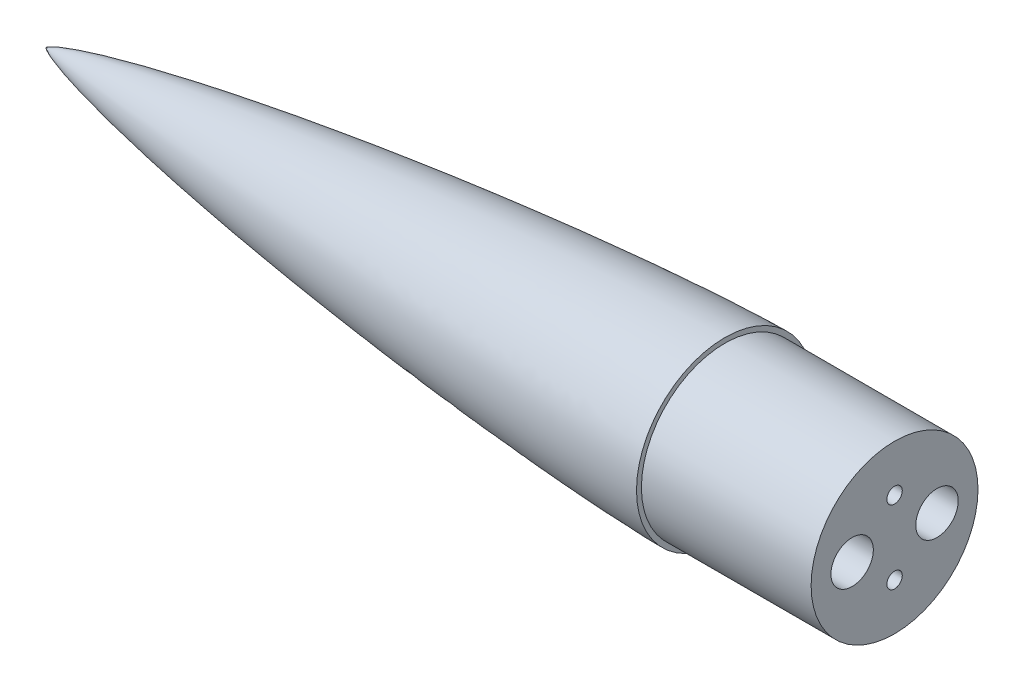
ISO-10303-21;
HEADER;
FILE_DESCRIPTION(('STEP AP214'),'2;1');
FILE_NAME('part.step','',(''),(''),'','','');
FILE_SCHEMA(('AUTOMOTIVE_DESIGN { 1 0 10303 214 1 1 1 1 }'));
ENDSEC;
DATA;
#1=APPLICATION_CONTEXT('core data for automotive mechanical design processes');
#2=APPLICATION_PROTOCOL_DEFINITION('international standard','automotive_design',2000,#1);
#3=PRODUCT_CONTEXT('',#1,'mechanical');
#4=PRODUCT('Part','Part','',(#3));
#5=PRODUCT_RELATED_PRODUCT_CATEGORY('part','',(#4));
#6=PRODUCT_DEFINITION_FORMATION('','',#4);
#7=PRODUCT_DEFINITION_CONTEXT('part definition',#1,'design');
#8=PRODUCT_DEFINITION('design','',#6,#7);
#9=PRODUCT_DEFINITION_SHAPE('','',#8);
#10=(LENGTH_UNIT() NAMED_UNIT(*) SI_UNIT(.MILLI.,.METRE.));
#11=(NAMED_UNIT(*) PLANE_ANGLE_UNIT() SI_UNIT($,.RADIAN.));
#12=(NAMED_UNIT(*) SI_UNIT($,.STERADIAN.) SOLID_ANGLE_UNIT());
#13=UNCERTAINTY_MEASURE_WITH_UNIT(LENGTH_MEASURE(1.E-05),#10,'distance_accuracy_value','');
#14=(GEOMETRIC_REPRESENTATION_CONTEXT(3) GLOBAL_UNCERTAINTY_ASSIGNED_CONTEXT((#13)) GLOBAL_UNIT_ASSIGNED_CONTEXT((#10,
#11,#12)) REPRESENTATION_CONTEXT('',''));
#15=CARTESIAN_POINT('',(0.,0.,0.));
#16=DIRECTION('',(0.,0.,1.));
#17=DIRECTION('',(1.,0.,0.));
#18=AXIS2_PLACEMENT_3D('',#15,#16,#17);
#19=CARTESIAN_POINT('',(304.8,39.6748,0.));
#20=CARTESIAN_POINT('',(303.872082373973,39.671991976614,0.));
#21=CARTESIAN_POINT('',(302.016351639773,39.6495279999501,0.));
#22=CARTESIAN_POINT('',(298.305297440179,39.5803641603281,0.));
#23=CARTESIAN_POINT('',(289.805240869329,39.3397638003717,0.));
#24=CARTESIAN_POINT('',(277.4482923978,38.8292806671547,0.));
#25=CARTESIAN_POINT('',(261.241034268989,37.946600904853,0.));
#26=CARTESIAN_POINT('',(242.117188184233,36.6609808305585,0.));
#27=CARTESIAN_POINT('',(223.0084239732,35.1693661901991,0.));
#28=CARTESIAN_POINT('',(203.91514310052,33.4914676621827,0.));
#29=CARTESIAN_POINT('',(184.838106863507,31.638406978994,0.));
#30=CARTESIAN_POINT('',(165.778389570867,29.61481333413,0.));
#31=CARTESIAN_POINT('',(146.737633519414,27.4201336829005,0.));
#32=CARTESIAN_POINT('',(127.717963156555,25.0491135623444,0.));
#33=CARTESIAN_POINT('',(108.72270084017,22.4899976431651,0.));
#34=CARTESIAN_POINT('',(89.7562015035542,19.7244788911179,0.));
#35=CARTESIAN_POINT('',(70.8260307270531,16.72025635435,0.));
#36=CARTESIAN_POINT('',(51.9432438425553,13.4279106434573,0.));
#37=CARTESIAN_POINT('',(35.4348928714502,10.1995812292026,0.));
#38=CARTESIAN_POINT('',(22.086176793402,7.22996087670975,0.));
#39=CARTESIAN_POINT('',(12.6051442460218,4.76514298141007,0.));
#40=CARTESIAN_POINT('',(7.33062072263953,3.18453892450289,0.));
#41=CARTESIAN_POINT('',(4.16331169730398,2.08513387501985,0.));
#42=CARTESIAN_POINT('',(2.42150746169733,1.38792199920585,0.));
#43=CARTESIAN_POINT('',(1.45854263335302,0.948387219531718,0.));
#44=CARTESIAN_POINT('',(0.906754262882924,0.663154837131609,0.));
#45=CARTESIAN_POINT('',(0.581878865349174,0.475164864660977,0.));
#46=CARTESIAN_POINT('',(0.388654902415941,0.350880874644519,0.));
#47=CARTESIAN_POINT('',(0.261246618164474,0.260372290270949,0.));
#48=CARTESIAN_POINT('',(0.168386027419517,0.187594695998197,0.));
#49=CARTESIAN_POINT('',(0.104001435047584,0.131550788230049,0.));
#50=CARTESIAN_POINT('',(0.0549775205160579,0.082482136166313,0.));
#51=CARTESIAN_POINT('',(0.0214451202254663,0.041133144768579,0.));
#52=CARTESIAN_POINT('',(0.00701970951419905,0.0186474513729437,0.));
#53=CARTESIAN_POINT('',(0.00199001597706555,0.00638034282283625,0.));
#54=CARTESIAN_POINT('',(0.,0.,0.));
#55=B_SPLINE_CURVE_WITH_KNOTS('',4,(#19,#20,#21,#22,#23,#24,#25,#26,#27,#28,#29,#30,#31,#32,#33,
#34,#35,#36,#37,#38,#39,#40,#41,#42,#43,#44,#45,#46,#47,#48,#49,#50,#51,#52,#53,#54),
.UNSPECIFIED.,.F.,.F.,(5,1,1,1,1,1,1,1,1,1,1,1,1,1,1,1,1,1,1,1,1,1,1,1,1,1,1,1,1,1,1,1,5),(0.,
0.0120407224304167,0.0240814448608334,0.0481628897216668,0.110339603302425,0.172516315880672,
0.234693028557676,0.296869741619763,0.35904645437603,0.421223166627213,0.483399880722471,
0.545576592716714,0.607753304395923,0.669930016432356,0.732106728284708,0.794283440311138,
0.85646015608543,0.918636853254426,0.950360387088669,0.971698723752524,0.983552076312659,
0.990067750985845,0.993851378605739,0.996035286875387,0.997282787614793,0.998124662362034,
0.998720392553439,0.999015250050672,0.999310107547904,0.999655053773952,0.999827526886976,
0.999913763443488,1.),.UNSPECIFIED.);
#56=CARTESIAN_POINT('',(0.,0.,0.));
#57=DIRECTION('',(-1.,0.,0.));
#58=AXIS1_PLACEMENT('',#56,#57);
#59=SURFACE_OF_REVOLUTION('',#55,#58);
#60=CARTESIAN_POINT('',(0.,0.,0.));
#61=VERTEX_POINT('',#60);
#62=VERTEX_LOOP('',#61);
#63=FACE_BOUND('',#62,.T.);
#64=CARTESIAN_POINT('',(304.8,0.,0.));
#65=DIRECTION('',(-1.,0.,0.));
#66=DIRECTION('',(0.,0.,1.));
#67=AXIS2_PLACEMENT_3D('',#64,#65,#66);
#68=CIRCLE('',#67,39.6748);
#69=CARTESIAN_POINT('',(304.8,0.,39.6748));
#70=VERTEX_POINT('',#69);
#71=EDGE_CURVE('E51',#70,#70,#68,.T.);
#72=ORIENTED_EDGE('',*,*,#71,.T.);
#73=EDGE_LOOP('',(#72));
#74=FACE_BOUND('',#73,.T.);
#75=ADVANCED_FACE('F43',(#63,#74),#59,.T.);
#76=CARTESIAN_POINT('',(304.8,0.,0.));
#77=DIRECTION('',(-1.,0.,0.));
#78=DIRECTION('',(0.,0.,1.));
#79=AXIS2_PLACEMENT_3D('',#76,#77,#78);
#80=PLANE('',#79);
#81=CARTESIAN_POINT('',(304.8,0.,0.));
#82=DIRECTION('',(-1.,0.,0.));
#83=DIRECTION('',(0.,0.,1.));
#84=AXIS2_PLACEMENT_3D('',#81,#82,#83);
#85=CIRCLE('',#84,37.465);
#86=CARTESIAN_POINT('',(304.8,0.,37.465));
#87=VERTEX_POINT('',#86);
#88=EDGE_CURVE('E11',#87,#87,#85,.F.);
#89=ORIENTED_EDGE('',*,*,#88,.F.);
#90=EDGE_LOOP('',(#89));
#91=FACE_BOUND('',#90,.T.);
#92=ORIENTED_EDGE('',*,*,#71,.F.);
#93=EDGE_LOOP('',(#92));
#94=FACE_BOUND('',#93,.T.);
#95=ADVANCED_FACE('F56',(#91,#94),#80,.F.);
#96=CARTESIAN_POINT('',(355.6,0.,0.));
#97=DIRECTION('',(-1.,0.,0.));
#98=DIRECTION('',(0.,0.,1.));
#99=AXIS2_PLACEMENT_3D('',#96,#97,#98);
#100=CYLINDRICAL_SURFACE('',#99,37.465);
#101=ORIENTED_EDGE('',*,*,#88,.T.);
#102=EDGE_LOOP('',(#101));
#103=FACE_BOUND('',#102,.T.);
#104=CARTESIAN_POINT('',(381.,0.,0.));
#105=DIRECTION('',(1.,0.,0.));
#106=DIRECTION('',(0.,0.,-1.));
#107=AXIS2_PLACEMENT_3D('',#104,#105,#106);
#108=CIRCLE('',#107,37.465);
#109=CARTESIAN_POINT('',(381.,0.,-37.465));
#110=VERTEX_POINT('',#109);
#111=EDGE_CURVE('E76',#110,#110,#108,.T.);
#112=ORIENTED_EDGE('',*,*,#111,.F.);
#113=EDGE_LOOP('',(#112));
#114=FACE_BOUND('',#113,.T.);
#115=ADVANCED_FACE('F118',(#103,#114),#100,.T.);
#116=CARTESIAN_POINT('',(381.,0.,0.));
#117=DIRECTION('',(1.,0.,0.));
#118=DIRECTION('',(0.,0.,-1.));
#119=AXIS2_PLACEMENT_3D('',#116,#117,#118);
#120=PLANE('',#119);
#121=CARTESIAN_POINT('',(381.,16.51,0.));
#122=DIRECTION('',(1.,0.,0.));
#123=DIRECTION('',(0.,0.,-1.));
#124=AXIS2_PLACEMENT_3D('',#121,#122,#123);
#125=CIRCLE('',#124,3.4671);
#126=CARTESIAN_POINT('',(381.,16.51,-3.4671));
#127=VERTEX_POINT('',#126);
#128=EDGE_CURVE('E97',#127,#127,#125,.T.);
#129=ORIENTED_EDGE('',*,*,#128,.F.);
#130=EDGE_LOOP('',(#129));
#131=FACE_BOUND('',#130,.T.);
#132=CARTESIAN_POINT('',(381.,-16.51,0.));
#133=DIRECTION('',(1.,0.,0.));
#134=DIRECTION('',(0.,0.,-1.));
#135=AXIS2_PLACEMENT_3D('',#132,#133,#134);
#136=CIRCLE('',#135,3.4671);
#137=CARTESIAN_POINT('',(381.,-16.51,-3.4671));
#138=VERTEX_POINT('',#137);
#139=EDGE_CURVE('E93',#138,#138,#136,.T.);
#140=ORIENTED_EDGE('',*,*,#139,.F.);
#141=EDGE_LOOP('',(#140));
#142=FACE_BOUND('',#141,.T.);
#143=CARTESIAN_POINT('',(381.,0.,19.05));
#144=DIRECTION('',(1.,0.,0.));
#145=DIRECTION('',(0.,0.,-1.));
#146=AXIS2_PLACEMENT_3D('',#143,#144,#145);
#147=CIRCLE('',#146,9.525);
#148=CARTESIAN_POINT('',(381.,0.,9.525));
#149=VERTEX_POINT('',#148);
#150=EDGE_CURVE('E80',#149,#149,#147,.T.);
#151=ORIENTED_EDGE('',*,*,#150,.F.);
#152=EDGE_LOOP('',(#151));
#153=FACE_BOUND('',#152,.T.);
#154=ORIENTED_EDGE('',*,*,#111,.T.);
#155=EDGE_LOOP('',(#154));
#156=FACE_BOUND('',#155,.T.);
#157=CARTESIAN_POINT('',(381.,0.,-19.05));
#158=DIRECTION('',(1.,0.,0.));
#159=DIRECTION('',(0.,0.,-1.));
#160=AXIS2_PLACEMENT_3D('',#157,#158,#159);
#161=CIRCLE('',#160,9.525);
#162=CARTESIAN_POINT('',(381.,0.,-28.575));
#163=VERTEX_POINT('',#162);
#164=EDGE_CURVE('E84',#163,#163,#161,.T.);
#165=ORIENTED_EDGE('',*,*,#164,.F.);
#166=EDGE_LOOP('',(#165));
#167=FACE_BOUND('',#166,.T.);
#168=ADVANCED_FACE('F114',(#131,#142,#153,#156,#167),#120,.T.);
#169=CARTESIAN_POINT('',(381.,0.,19.05));
#170=DIRECTION('',(-1.,0.,0.));
#171=DIRECTION('',(0.,0.,1.));
#172=AXIS2_PLACEMENT_3D('',#169,#170,#171);
#173=CYLINDRICAL_SURFACE('',#172,9.525);
#174=ORIENTED_EDGE('',*,*,#150,.T.);
#175=EDGE_LOOP('',(#174));
#176=FACE_BOUND('',#175,.T.);
#177=CARTESIAN_POINT('',(355.6,0.,19.05));
#178=DIRECTION('',(1.,0.,0.));
#179=DIRECTION('',(0.,0.,-1.));
#180=AXIS2_PLACEMENT_3D('',#177,#178,#179);
#181=CIRCLE('',#180,9.525);
#182=CARTESIAN_POINT('',(355.6,0.,28.575));
#183=VERTEX_POINT('',#182);
#184=EDGE_CURVE('E64',#183,#183,#181,.T.);
#185=ORIENTED_EDGE('',*,*,#184,.F.);
#186=EDGE_LOOP('',(#185));
#187=FACE_BOUND('',#186,.T.);
#188=ADVANCED_FACE('F117',(#176,#187),#173,.F.);
#189=CARTESIAN_POINT('',(381.,0.,-19.05));
#190=DIRECTION('',(-1.,0.,0.));
#191=DIRECTION('',(0.,0.,1.));
#192=AXIS2_PLACEMENT_3D('',#189,#190,#191);
#193=CYLINDRICAL_SURFACE('',#192,9.525);
#194=ORIENTED_EDGE('',*,*,#164,.T.);
#195=EDGE_LOOP('',(#194));
#196=FACE_BOUND('',#195,.T.);
#197=CARTESIAN_POINT('',(355.6,0.,-19.05));
#198=DIRECTION('',(-1.,0.,0.));
#199=DIRECTION('',(0.,0.,1.));
#200=AXIS2_PLACEMENT_3D('',#197,#198,#199);
#201=CIRCLE('',#200,9.525);
#202=CARTESIAN_POINT('',(355.6,0.,-28.575));
#203=VERTEX_POINT('',#202);
#204=EDGE_CURVE('E61',#203,#203,#201,.T.);
#205=ORIENTED_EDGE('',*,*,#204,.T.);
#206=EDGE_LOOP('',(#205));
#207=FACE_BOUND('',#206,.T.);
#208=ADVANCED_FACE('F128',(#196,#207),#193,.F.);
#209=CARTESIAN_POINT('',(355.6,0.,0.));
#210=DIRECTION('',(0.,1.,0.));
#211=DIRECTION('',(0.,0.,1.));
#212=AXIS2_PLACEMENT_3D('',#209,#210,#211);
#213=TOROIDAL_SURFACE('',#212,19.05,9.525);
#214=CARTESIAN_POINT('',(355.6,0.,0.));
#215=DIRECTION('',(0.,1.,0.));
#216=DIRECTION('',(0.,0.,1.));
#217=AXIS2_PLACEMENT_3D('',#214,#215,#216);
#218=CIRCLE('',#217,28.575);
#219=EDGE_CURVE('',#203,#183,#218,.T.);
#220=ORIENTED_EDGE('',*,*,#204,.F.);
#221=ORIENTED_EDGE('',*,*,#184,.T.);
#222=ORIENTED_EDGE('',*,*,#219,.T.);
#223=ORIENTED_EDGE('',*,*,#219,.F.);
#224=EDGE_LOOP('',(#220,#222,#221,#223));
#225=FACE_BOUND('',#224,.T.);
#226=ADVANCED_FACE('F131',(#225),#213,.F.);
#227=CARTESIAN_POINT('',(127.,-16.51,0.));
#228=DIRECTION('',(1.,0.,0.));
#229=DIRECTION('',(0.,0.,-1.));
#230=AXIS2_PLACEMENT_3D('',#227,#228,#229);
#231=CYLINDRICAL_SURFACE('',#230,3.4671);
#232=CARTESIAN_POINT('',(127.,-16.51,0.));
#233=DIRECTION('',(1.,0.,0.));
#234=DIRECTION('',(0.,0.,-1.));
#235=AXIS2_PLACEMENT_3D('',#232,#233,#234);
#236=CIRCLE('',#235,3.4671);
#237=CARTESIAN_POINT('',(127.,-16.51,-3.4671));
#238=VERTEX_POINT('',#237);
#239=EDGE_CURVE('E89',#238,#238,#236,.T.);
#240=ORIENTED_EDGE('',*,*,#239,.F.);
#241=EDGE_LOOP('',(#240));
#242=FACE_BOUND('',#241,.T.);
#243=ORIENTED_EDGE('',*,*,#139,.T.);
#244=EDGE_LOOP('',(#243));
#245=FACE_BOUND('',#244,.T.);
#246=ADVANCED_FACE('F137',(#242,#245),#231,.F.);
#247=CARTESIAN_POINT('',(127.,-16.51,0.));
#248=DIRECTION('',(1.,0.,0.));
#249=DIRECTION('',(0.,0.,-1.));
#250=AXIS2_PLACEMENT_3D('',#247,#248,#249);
#251=PLANE('',#250);
#252=ORIENTED_EDGE('',*,*,#239,.T.);
#253=EDGE_LOOP('',(#252));
#254=FACE_BOUND('',#253,.T.);
#255=ADVANCED_FACE('F110',(#254),#251,.T.);
#256=CARTESIAN_POINT('',(127.,16.51,0.));
#257=DIRECTION('',(1.,0.,0.));
#258=DIRECTION('',(0.,0.,-1.));
#259=AXIS2_PLACEMENT_3D('',#256,#257,#258);
#260=CYLINDRICAL_SURFACE('',#259,3.4671);
#261=CARTESIAN_POINT('',(127.,16.51,0.));
#262=DIRECTION('',(1.,0.,0.));
#263=DIRECTION('',(0.,0.,-1.));
#264=AXIS2_PLACEMENT_3D('',#261,#262,#263);
#265=CIRCLE('',#264,3.4671);
#266=CARTESIAN_POINT('',(127.,16.51,-3.4671));
#267=VERTEX_POINT('',#266);
#268=EDGE_CURVE('E88',#267,#267,#265,.T.);
#269=ORIENTED_EDGE('',*,*,#268,.F.);
#270=EDGE_LOOP('',(#269));
#271=FACE_BOUND('',#270,.T.);
#272=ORIENTED_EDGE('',*,*,#128,.T.);
#273=EDGE_LOOP('',(#272));
#274=FACE_BOUND('',#273,.T.);
#275=ADVANCED_FACE('F107',(#271,#274),#260,.F.);
#276=CARTESIAN_POINT('',(127.,16.51,0.));
#277=DIRECTION('',(1.,0.,0.));
#278=DIRECTION('',(0.,0.,-1.));
#279=AXIS2_PLACEMENT_3D('',#276,#277,#278);
#280=PLANE('',#279);
#281=ORIENTED_EDGE('',*,*,#268,.T.);
#282=EDGE_LOOP('',(#281));
#283=FACE_BOUND('',#282,.T.);
#284=ADVANCED_FACE('F105',(#283),#280,.T.);
#285=CLOSED_SHELL('',(#75,#95,#115,#168,#188,#208,#226,#246,#255,#275,#284));
#286=MANIFOLD_SOLID_BREP('B2',#285);
#287=ADVANCED_BREP_SHAPE_REPRESENTATION('',(#18,#286),#14);
#288=SHAPE_DEFINITION_REPRESENTATION(#9,#287);
ENDSEC;
END-ISO-10303-21;
